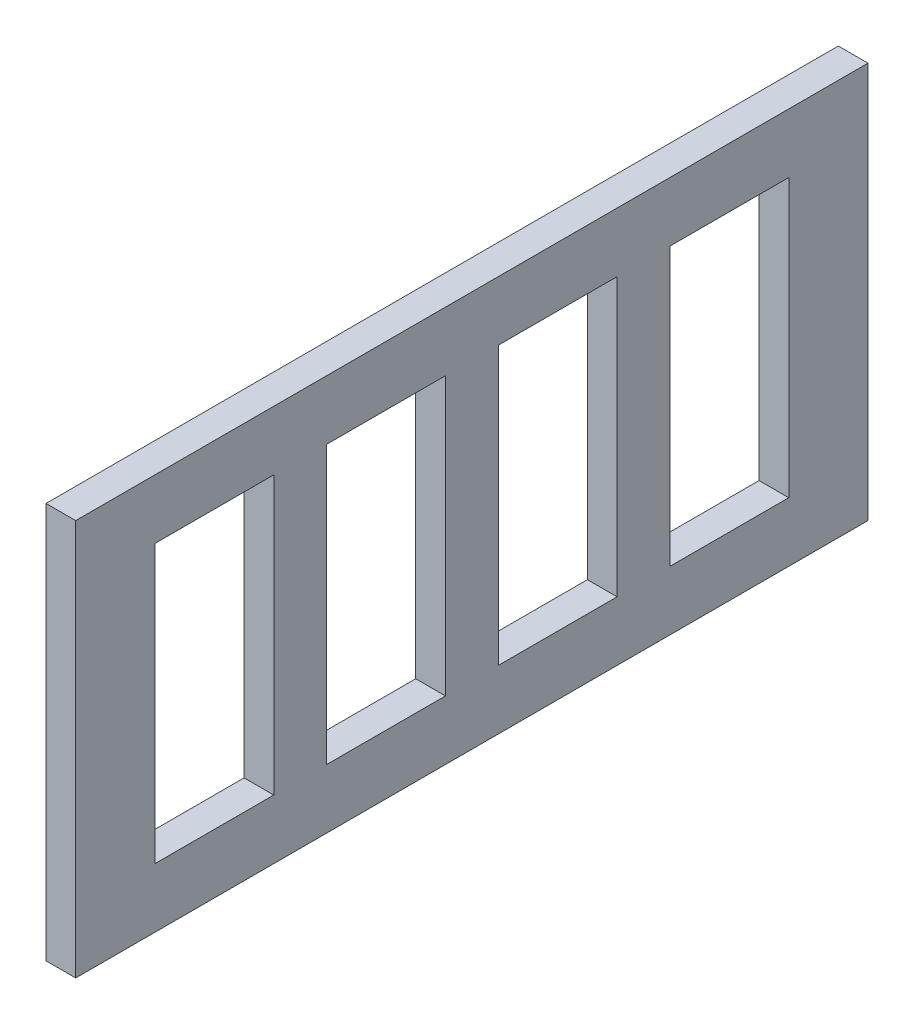
ISO-10303-21;
HEADER;
FILE_DESCRIPTION(('STEP AP214'),'2;1');
FILE_NAME('part.step','',(''),(''),'','','');
FILE_SCHEMA(('AUTOMOTIVE_DESIGN { 1 0 10303 214 1 1 1 1 }'));
ENDSEC;
DATA;
#1=APPLICATION_CONTEXT('core data for automotive mechanical design processes');
#2=APPLICATION_PROTOCOL_DEFINITION('international standard','automotive_design',2000,#1);
#3=PRODUCT_CONTEXT('',#1,'mechanical');
#4=PRODUCT('Part','Part','',(#3));
#5=PRODUCT_RELATED_PRODUCT_CATEGORY('part','',(#4));
#6=PRODUCT_DEFINITION_FORMATION('','',#4);
#7=PRODUCT_DEFINITION_CONTEXT('part definition',#1,'design');
#8=PRODUCT_DEFINITION('design','',#6,#7);
#9=PRODUCT_DEFINITION_SHAPE('','',#8);
#10=(LENGTH_UNIT() NAMED_UNIT(*) SI_UNIT(.MILLI.,.METRE.));
#11=(NAMED_UNIT(*) PLANE_ANGLE_UNIT() SI_UNIT($,.RADIAN.));
#12=(NAMED_UNIT(*) SI_UNIT($,.STERADIAN.) SOLID_ANGLE_UNIT());
#13=UNCERTAINTY_MEASURE_WITH_UNIT(LENGTH_MEASURE(1.E-05),#10,'distance_accuracy_value','');
#14=(GEOMETRIC_REPRESENTATION_CONTEXT(3) GLOBAL_UNCERTAINTY_ASSIGNED_CONTEXT((#13)) GLOBAL_UNIT_ASSIGNED_CONTEXT((#10,
#11,#12)) REPRESENTATION_CONTEXT('',''));
#15=CARTESIAN_POINT('',(0.,0.,0.));
#16=DIRECTION('',(0.,0.,1.));
#17=DIRECTION('',(1.,0.,0.));
#18=AXIS2_PLACEMENT_3D('',#15,#16,#17);
#19=CARTESIAN_POINT('',(15.,0.,0.));
#20=DIRECTION('',(-1.,0.,0.));
#21=DIRECTION('',(0.,0.,1.));
#22=AXIS2_PLACEMENT_3D('',#19,#20,#21);
#23=PLANE('',#22);
#24=DIRECTION('',(0.,0.,1.));
#25=VECTOR('',#24,1.);
#26=CARTESIAN_POINT('',(15.,170.,-13.3333333333333));
#27=LINE('',#26,#25);
#28=CARTESIAN_POINT('',(15.,170.,-73.3333333333333));
#29=VERTEX_POINT('',#28);
#30=CARTESIAN_POINT('',(15.,170.,-13.3333333333333));
#31=VERTEX_POINT('',#30);
#32=EDGE_CURVE('E225',#29,#31,#27,.T.);
#33=ORIENTED_EDGE('',*,*,#32,.F.);
#34=DIRECTION('',(0.,1.,0.));
#35=VECTOR('',#34,1.);
#36=CARTESIAN_POINT('',(15.,170.,-73.3333333333333));
#37=LINE('',#36,#35);
#38=CARTESIAN_POINT('',(15.,30.,-73.3333333333333));
#39=VERTEX_POINT('',#38);
#40=EDGE_CURVE('E236',#39,#29,#37,.T.);
#41=ORIENTED_EDGE('',*,*,#40,.F.);
#42=DIRECTION('',(0.,0.,-1.));
#43=VECTOR('',#42,1.);
#44=CARTESIAN_POINT('',(15.,30.,-13.3333333333334));
#45=LINE('',#44,#43);
#46=CARTESIAN_POINT('',(15.,30.,-13.3333333333334));
#47=VERTEX_POINT('',#46);
#48=EDGE_CURVE('E232',#47,#39,#45,.T.);
#49=ORIENTED_EDGE('',*,*,#48,.F.);
#50=DIRECTION('',(0.,-1.,0.));
#51=VECTOR('',#50,1.);
#52=CARTESIAN_POINT('',(15.,170.,-13.3333333333333));
#53=LINE('',#52,#51);
#54=EDGE_CURVE('E228',#31,#47,#53,.T.);
#55=ORIENTED_EDGE('',*,*,#54,.F.);
#56=EDGE_LOOP('',(#33,#41,#49,#55));
#57=FACE_BOUND('',#56,.T.);
#58=DIRECTION('',(0.,-1.,0.));
#59=VECTOR('',#58,1.);
#60=CARTESIAN_POINT('',(15.,170.,160.));
#61=LINE('',#60,#59);
#62=CARTESIAN_POINT('',(15.,170.,160.));
#63=VERTEX_POINT('',#62);
#64=CARTESIAN_POINT('',(15.,30.,160.));
#65=VERTEX_POINT('',#64);
#66=EDGE_CURVE('E311',#63,#65,#61,.T.);
#67=ORIENTED_EDGE('',*,*,#66,.F.);
#68=DIRECTION('',(0.,0.,1.));
#69=VECTOR('',#68,1.);
#70=CARTESIAN_POINT('',(15.,170.,160.));
#71=LINE('',#70,#69);
#72=CARTESIAN_POINT('',(15.,170.,100.));
#73=VERTEX_POINT('',#72);
#74=EDGE_CURVE('E322',#73,#63,#71,.T.);
#75=ORIENTED_EDGE('',*,*,#74,.F.);
#76=DIRECTION('',(0.,1.,0.));
#77=VECTOR('',#76,1.);
#78=CARTESIAN_POINT('',(15.,170.,100.));
#79=LINE('',#78,#77);
#80=CARTESIAN_POINT('',(15.,30.,100.));
#81=VERTEX_POINT('',#80);
#82=EDGE_CURVE('E318',#81,#73,#79,.T.);
#83=ORIENTED_EDGE('',*,*,#82,.F.);
#84=DIRECTION('',(0.,0.,-1.));
#85=VECTOR('',#84,1.);
#86=CARTESIAN_POINT('',(15.,30.,160.));
#87=LINE('',#86,#85);
#88=EDGE_CURVE('E314',#65,#81,#87,.T.);
#89=ORIENTED_EDGE('',*,*,#88,.F.);
#90=EDGE_LOOP('',(#67,#75,#83,#89));
#91=FACE_BOUND('',#90,.T.);
#92=DIRECTION('',(0.,-1.,0.));
#93=VECTOR('',#92,1.);
#94=CARTESIAN_POINT('',(15.,0.,200.));
#95=LINE('',#94,#93);
#96=CARTESIAN_POINT('',(15.,200.,200.));
#97=VERTEX_POINT('',#96);
#98=CARTESIAN_POINT('',(15.,0.,200.));
#99=VERTEX_POINT('',#98);
#100=EDGE_CURVE('E354',#97,#99,#95,.T.);
#101=ORIENTED_EDGE('',*,*,#100,.T.);
#102=DIRECTION('',(0.,0.,-1.));
#103=VECTOR('',#102,1.);
#104=CARTESIAN_POINT('',(15.,0.,200.));
#105=LINE('',#104,#103);
#106=CARTESIAN_POINT('',(15.,0.,-200.));
#107=VERTEX_POINT('',#106);
#108=EDGE_CURVE('E358',#99,#107,#105,.T.);
#109=ORIENTED_EDGE('',*,*,#108,.T.);
#110=DIRECTION('',(0.,1.,0.));
#111=VECTOR('',#110,1.);
#112=CARTESIAN_POINT('',(15.,0.,-200.));
#113=LINE('',#112,#111);
#114=CARTESIAN_POINT('',(15.,200.,-200.));
#115=VERTEX_POINT('',#114);
#116=EDGE_CURVE('E362',#107,#115,#113,.T.);
#117=ORIENTED_EDGE('',*,*,#116,.T.);
#118=DIRECTION('',(0.,0.,1.));
#119=VECTOR('',#118,1.);
#120=CARTESIAN_POINT('',(15.,200.,200.));
#121=LINE('',#120,#119);
#122=EDGE_CURVE('E365',#115,#97,#121,.T.);
#123=ORIENTED_EDGE('',*,*,#122,.T.);
#124=EDGE_LOOP('',(#101,#109,#117,#123));
#125=FACE_BOUND('',#124,.T.);
#126=DIRECTION('',(0.,0.,1.));
#127=VECTOR('',#126,1.);
#128=CARTESIAN_POINT('',(15.,170.,73.3333333333333));
#129=LINE('',#128,#127);
#130=CARTESIAN_POINT('',(15.,170.,13.3333333333333));
#131=VERTEX_POINT('',#130);
#132=CARTESIAN_POINT('',(15.,170.,73.3333333333333));
#133=VERTEX_POINT('',#132);
#134=EDGE_CURVE('E268',#131,#133,#129,.T.);
#135=ORIENTED_EDGE('',*,*,#134,.F.);
#136=DIRECTION('',(0.,1.,0.));
#137=VECTOR('',#136,1.);
#138=CARTESIAN_POINT('',(15.,170.,13.3333333333333));
#139=LINE('',#138,#137);
#140=CARTESIAN_POINT('',(15.,30.,13.3333333333333));
#141=VERTEX_POINT('',#140);
#142=EDGE_CURVE('E279',#141,#131,#139,.T.);
#143=ORIENTED_EDGE('',*,*,#142,.F.);
#144=DIRECTION('',(0.,0.,-1.));
#145=VECTOR('',#144,1.);
#146=CARTESIAN_POINT('',(15.,30.,73.3333333333333));
#147=LINE('',#146,#145);
#148=CARTESIAN_POINT('',(15.,30.,73.3333333333333));
#149=VERTEX_POINT('',#148);
#150=EDGE_CURVE('E275',#149,#141,#147,.T.);
#151=ORIENTED_EDGE('',*,*,#150,.F.);
#152=DIRECTION('',(0.,-1.,0.));
#153=VECTOR('',#152,1.);
#154=CARTESIAN_POINT('',(15.,170.,73.3333333333333));
#155=LINE('',#154,#153);
#156=EDGE_CURVE('E271',#133,#149,#155,.T.);
#157=ORIENTED_EDGE('',*,*,#156,.F.);
#158=EDGE_LOOP('',(#135,#143,#151,#157));
#159=FACE_BOUND('',#158,.T.);
#160=DIRECTION('',(0.,0.,1.));
#161=VECTOR('',#160,1.);
#162=CARTESIAN_POINT('',(15.,170.,-100.));
#163=LINE('',#162,#161);
#164=CARTESIAN_POINT('',(15.,170.,-160.));
#165=VERTEX_POINT('',#164);
#166=CARTESIAN_POINT('',(15.,170.,-100.));
#167=VERTEX_POINT('',#166);
#168=EDGE_CURVE('E177',#165,#167,#163,.T.);
#169=ORIENTED_EDGE('',*,*,#168,.F.);
#170=DIRECTION('',(0.,1.,0.));
#171=VECTOR('',#170,1.);
#172=CARTESIAN_POINT('',(15.,170.,-160.));
#173=LINE('',#172,#171);
#174=CARTESIAN_POINT('',(15.,30.,-160.));
#175=VERTEX_POINT('',#174);
#176=EDGE_CURVE('E203',#175,#165,#173,.T.);
#177=ORIENTED_EDGE('',*,*,#176,.F.);
#178=DIRECTION('',(0.,0.,-1.));
#179=VECTOR('',#178,1.);
#180=CARTESIAN_POINT('',(15.,30.,-100.));
#181=LINE('',#180,#179);
#182=CARTESIAN_POINT('',(15.,30.,-100.));
#183=VERTEX_POINT('',#182);
#184=EDGE_CURVE('E199',#183,#175,#181,.T.);
#185=ORIENTED_EDGE('',*,*,#184,.F.);
#186=DIRECTION('',(0.,-1.,0.));
#187=VECTOR('',#186,1.);
#188=CARTESIAN_POINT('',(15.,170.,-100.));
#189=LINE('',#188,#187);
#190=EDGE_CURVE('E186',#167,#183,#189,.T.);
#191=ORIENTED_EDGE('',*,*,#190,.F.);
#192=EDGE_LOOP('',(#169,#177,#185,#191));
#193=FACE_BOUND('',#192,.T.);
#194=ADVANCED_FACE('F39',(#57,#91,#125,#159,#193),#23,.F.);
#195=CARTESIAN_POINT('',(0.,0.,0.));
#196=DIRECTION('',(-1.,0.,0.));
#197=DIRECTION('',(0.,0.,1.));
#198=AXIS2_PLACEMENT_3D('',#195,#196,#197);
#199=PLANE('',#198);
#200=DIRECTION('',(0.,-1.,0.));
#201=VECTOR('',#200,1.);
#202=CARTESIAN_POINT('',(0.,0.,200.));
#203=LINE('',#202,#201);
#204=CARTESIAN_POINT('',(0.,200.,200.));
#205=VERTEX_POINT('',#204);
#206=CARTESIAN_POINT('',(0.,0.,200.));
#207=VERTEX_POINT('',#206);
#208=EDGE_CURVE('E353',#205,#207,#203,.T.);
#209=ORIENTED_EDGE('',*,*,#208,.F.);
#210=DIRECTION('',(0.,0.,1.));
#211=VECTOR('',#210,1.);
#212=CARTESIAN_POINT('',(0.,200.,200.));
#213=LINE('',#212,#211);
#214=CARTESIAN_POINT('',(0.,200.,-200.));
#215=VERTEX_POINT('',#214);
#216=EDGE_CURVE('E359',#215,#205,#213,.T.);
#217=ORIENTED_EDGE('',*,*,#216,.F.);
#218=DIRECTION('',(0.,1.,0.));
#219=VECTOR('',#218,1.);
#220=CARTESIAN_POINT('',(0.,0.,-200.));
#221=LINE('',#220,#219);
#222=CARTESIAN_POINT('',(0.,0.,-200.));
#223=VERTEX_POINT('',#222);
#224=EDGE_CURVE('E375',#223,#215,#221,.T.);
#225=ORIENTED_EDGE('',*,*,#224,.F.);
#226=DIRECTION('',(0.,0.,-1.));
#227=VECTOR('',#226,1.);
#228=CARTESIAN_POINT('',(0.,0.,200.));
#229=LINE('',#228,#227);
#230=EDGE_CURVE('E372',#207,#223,#229,.T.);
#231=ORIENTED_EDGE('',*,*,#230,.F.);
#232=EDGE_LOOP('',(#209,#217,#225,#231));
#233=FACE_BOUND('',#232,.T.);
#234=DIRECTION('',(0.,0.,1.));
#235=VECTOR('',#234,1.);
#236=CARTESIAN_POINT('',(0.,170.,160.));
#237=LINE('',#236,#235);
#238=CARTESIAN_POINT('',(0.,170.,100.));
#239=VERTEX_POINT('',#238);
#240=CARTESIAN_POINT('',(0.,170.,160.));
#241=VERTEX_POINT('',#240);
#242=EDGE_CURVE('E315',#239,#241,#237,.T.);
#243=ORIENTED_EDGE('',*,*,#242,.T.);
#244=DIRECTION('',(0.,-1.,0.));
#245=VECTOR('',#244,1.);
#246=CARTESIAN_POINT('',(0.,170.,160.));
#247=LINE('',#246,#245);
#248=CARTESIAN_POINT('',(0.,30.,160.));
#249=VERTEX_POINT('',#248);
#250=EDGE_CURVE('E310',#241,#249,#247,.T.);
#251=ORIENTED_EDGE('',*,*,#250,.T.);
#252=DIRECTION('',(0.,0.,-1.));
#253=VECTOR('',#252,1.);
#254=CARTESIAN_POINT('',(0.,30.,160.));
#255=LINE('',#254,#253);
#256=CARTESIAN_POINT('',(0.,30.,100.));
#257=VERTEX_POINT('',#256);
#258=EDGE_CURVE('E329',#249,#257,#255,.T.);
#259=ORIENTED_EDGE('',*,*,#258,.T.);
#260=DIRECTION('',(0.,1.,0.));
#261=VECTOR('',#260,1.);
#262=CARTESIAN_POINT('',(0.,170.,100.));
#263=LINE('',#262,#261);
#264=EDGE_CURVE('E333',#257,#239,#263,.T.);
#265=ORIENTED_EDGE('',*,*,#264,.T.);
#266=EDGE_LOOP('',(#243,#251,#259,#265));
#267=FACE_BOUND('',#266,.T.);
#268=DIRECTION('',(0.,1.,0.));
#269=VECTOR('',#268,1.);
#270=CARTESIAN_POINT('',(0.,170.,13.3333333333333));
#271=LINE('',#270,#269);
#272=CARTESIAN_POINT('',(0.,30.,13.3333333333333));
#273=VERTEX_POINT('',#272);
#274=CARTESIAN_POINT('',(0.,170.,13.3333333333333));
#275=VERTEX_POINT('',#274);
#276=EDGE_CURVE('E272',#273,#275,#271,.T.);
#277=ORIENTED_EDGE('',*,*,#276,.T.);
#278=DIRECTION('',(0.,0.,1.));
#279=VECTOR('',#278,1.);
#280=CARTESIAN_POINT('',(0.,170.,73.3333333333333));
#281=LINE('',#280,#279);
#282=CARTESIAN_POINT('',(0.,170.,73.3333333333333));
#283=VERTEX_POINT('',#282);
#284=EDGE_CURVE('E267',#275,#283,#281,.T.);
#285=ORIENTED_EDGE('',*,*,#284,.T.);
#286=DIRECTION('',(0.,-1.,0.));
#287=VECTOR('',#286,1.);
#288=CARTESIAN_POINT('',(0.,170.,73.3333333333333));
#289=LINE('',#288,#287);
#290=CARTESIAN_POINT('',(0.,30.,73.3333333333333));
#291=VERTEX_POINT('',#290);
#292=EDGE_CURVE('E286',#283,#291,#289,.T.);
#293=ORIENTED_EDGE('',*,*,#292,.T.);
#294=DIRECTION('',(0.,0.,-1.));
#295=VECTOR('',#294,1.);
#296=CARTESIAN_POINT('',(0.,30.,73.3333333333333));
#297=LINE('',#296,#295);
#298=EDGE_CURVE('E290',#291,#273,#297,.T.);
#299=ORIENTED_EDGE('',*,*,#298,.T.);
#300=EDGE_LOOP('',(#277,#285,#293,#299));
#301=FACE_BOUND('',#300,.T.);
#302=DIRECTION('',(0.,1.,0.));
#303=VECTOR('',#302,1.);
#304=CARTESIAN_POINT('',(0.,170.,-73.3333333333333));
#305=LINE('',#304,#303);
#306=CARTESIAN_POINT('',(0.,30.,-73.3333333333333));
#307=VERTEX_POINT('',#306);
#308=CARTESIAN_POINT('',(0.,170.,-73.3333333333333));
#309=VERTEX_POINT('',#308);
#310=EDGE_CURVE('E229',#307,#309,#305,.T.);
#311=ORIENTED_EDGE('',*,*,#310,.T.);
#312=DIRECTION('',(0.,0.,1.));
#313=VECTOR('',#312,1.);
#314=CARTESIAN_POINT('',(0.,170.,-13.3333333333333));
#315=LINE('',#314,#313);
#316=CARTESIAN_POINT('',(0.,170.,-13.3333333333333));
#317=VERTEX_POINT('',#316);
#318=EDGE_CURVE('E195',#309,#317,#315,.T.);
#319=ORIENTED_EDGE('',*,*,#318,.T.);
#320=DIRECTION('',(0.,-1.,0.));
#321=VECTOR('',#320,1.);
#322=CARTESIAN_POINT('',(0.,170.,-13.3333333333333));
#323=LINE('',#322,#321);
#324=CARTESIAN_POINT('',(0.,30.,-13.3333333333334));
#325=VERTEX_POINT('',#324);
#326=EDGE_CURVE('E243',#317,#325,#323,.T.);
#327=ORIENTED_EDGE('',*,*,#326,.T.);
#328=DIRECTION('',(0.,0.,-1.));
#329=VECTOR('',#328,1.);
#330=CARTESIAN_POINT('',(0.,30.,-13.3333333333334));
#331=LINE('',#330,#329);
#332=EDGE_CURVE('E247',#325,#307,#331,.T.);
#333=ORIENTED_EDGE('',*,*,#332,.T.);
#334=EDGE_LOOP('',(#311,#319,#327,#333));
#335=FACE_BOUND('',#334,.T.);
#336=DIRECTION('',(0.,1.,0.));
#337=VECTOR('',#336,1.);
#338=CARTESIAN_POINT('',(0.,170.,-160.));
#339=LINE('',#338,#337);
#340=CARTESIAN_POINT('',(0.,30.,-160.));
#341=VERTEX_POINT('',#340);
#342=CARTESIAN_POINT('',(0.,170.,-160.));
#343=VERTEX_POINT('',#342);
#344=EDGE_CURVE('E187',#341,#343,#339,.T.);
#345=ORIENTED_EDGE('',*,*,#344,.T.);
#346=DIRECTION('',(0.,0.,1.));
#347=VECTOR('',#346,1.);
#348=CARTESIAN_POINT('',(0.,170.,-100.));
#349=LINE('',#348,#347);
#350=CARTESIAN_POINT('',(0.,170.,-100.));
#351=VERTEX_POINT('',#350);
#352=EDGE_CURVE('E63',#343,#351,#349,.T.);
#353=ORIENTED_EDGE('',*,*,#352,.T.);
#354=DIRECTION('',(0.,-1.,0.));
#355=VECTOR('',#354,1.);
#356=CARTESIAN_POINT('',(0.,170.,-100.));
#357=LINE('',#356,#355);
#358=CARTESIAN_POINT('',(0.,30.,-100.));
#359=VERTEX_POINT('',#358);
#360=EDGE_CURVE('E193',#351,#359,#357,.T.);
#361=ORIENTED_EDGE('',*,*,#360,.T.);
#362=DIRECTION('',(0.,0.,-1.));
#363=VECTOR('',#362,1.);
#364=CARTESIAN_POINT('',(0.,30.,-100.));
#365=LINE('',#364,#363);
#366=EDGE_CURVE('E212',#359,#341,#365,.T.);
#367=ORIENTED_EDGE('',*,*,#366,.T.);
#368=EDGE_LOOP('',(#345,#353,#361,#367));
#369=FACE_BOUND('',#368,.T.);
#370=ADVANCED_FACE('F398',(#233,#267,#301,#335,#369),#199,.T.);
#371=CARTESIAN_POINT('',(15.,0.,200.));
#372=DIRECTION('',(0.,0.,-1.));
#373=DIRECTION('',(-1.,0.,0.));
#374=AXIS2_PLACEMENT_3D('',#371,#372,#373);
#375=PLANE('',#374);
#376=ORIENTED_EDGE('',*,*,#208,.T.);
#377=DIRECTION('',(-1.,0.,0.));
#378=VECTOR('',#377,1.);
#379=CARTESIAN_POINT('',(15.,0.,200.));
#380=LINE('',#379,#378);
#381=EDGE_CURVE('E11',#99,#207,#380,.T.);
#382=ORIENTED_EDGE('',*,*,#381,.F.);
#383=ORIENTED_EDGE('',*,*,#100,.F.);
#384=DIRECTION('',(-1.,0.,0.));
#385=VECTOR('',#384,1.);
#386=CARTESIAN_POINT('',(15.,200.,200.));
#387=LINE('',#386,#385);
#388=EDGE_CURVE('E368',#97,#205,#387,.T.);
#389=ORIENTED_EDGE('',*,*,#388,.T.);
#390=EDGE_LOOP('',(#376,#382,#383,#389));
#391=FACE_BOUND('',#390,.T.);
#392=ADVANCED_FACE('F41',(#391),#375,.F.);
#393=CARTESIAN_POINT('',(15.,0.,200.));
#394=DIRECTION('',(0.,1.,0.));
#395=DIRECTION('',(0.,0.,1.));
#396=AXIS2_PLACEMENT_3D('',#393,#394,#395);
#397=PLANE('',#396);
#398=ORIENTED_EDGE('',*,*,#230,.T.);
#399=DIRECTION('',(-1.,0.,0.));
#400=VECTOR('',#399,1.);
#401=CARTESIAN_POINT('',(15.,0.,-200.));
#402=LINE('',#401,#400);
#403=EDGE_CURVE('E48',#107,#223,#402,.T.);
#404=ORIENTED_EDGE('',*,*,#403,.F.);
#405=ORIENTED_EDGE('',*,*,#108,.F.);
#406=ORIENTED_EDGE('',*,*,#381,.T.);
#407=EDGE_LOOP('',(#398,#404,#405,#406));
#408=FACE_BOUND('',#407,.T.);
#409=ADVANCED_FACE('F409',(#408),#397,.F.);
#410=CARTESIAN_POINT('',(15.,0.,-200.));
#411=DIRECTION('',(0.,0.,1.));
#412=DIRECTION('',(1.,0.,0.));
#413=AXIS2_PLACEMENT_3D('',#410,#411,#412);
#414=PLANE('',#413);
#415=ORIENTED_EDGE('',*,*,#224,.T.);
#416=DIRECTION('',(-1.,0.,0.));
#417=VECTOR('',#416,1.);
#418=CARTESIAN_POINT('',(15.,200.,-200.));
#419=LINE('',#418,#417);
#420=EDGE_CURVE('E383',#115,#215,#419,.T.);
#421=ORIENTED_EDGE('',*,*,#420,.F.);
#422=ORIENTED_EDGE('',*,*,#116,.F.);
#423=ORIENTED_EDGE('',*,*,#403,.T.);
#424=EDGE_LOOP('',(#415,#421,#422,#423));
#425=FACE_BOUND('',#424,.T.);
#426=ADVANCED_FACE('F392',(#425),#414,.F.);
#427=CARTESIAN_POINT('',(15.,200.,200.));
#428=DIRECTION('',(0.,-1.,0.));
#429=DIRECTION('',(0.,0.,-1.));
#430=AXIS2_PLACEMENT_3D('',#427,#428,#429);
#431=PLANE('',#430);
#432=ORIENTED_EDGE('',*,*,#216,.T.);
#433=ORIENTED_EDGE('',*,*,#388,.F.);
#434=ORIENTED_EDGE('',*,*,#122,.F.);
#435=ORIENTED_EDGE('',*,*,#420,.T.);
#436=EDGE_LOOP('',(#432,#433,#434,#435));
#437=FACE_BOUND('',#436,.T.);
#438=ADVANCED_FACE('F402',(#437),#431,.F.);
#439=CARTESIAN_POINT('',(15.,170.,160.));
#440=DIRECTION('',(0.,0.,-1.));
#441=DIRECTION('',(0.,1.,0.));
#442=AXIS2_PLACEMENT_3D('',#439,#440,#441);
#443=PLANE('',#442);
#444=ORIENTED_EDGE('',*,*,#250,.F.);
#445=DIRECTION('',(-1.,0.,0.));
#446=VECTOR('',#445,1.);
#447=CARTESIAN_POINT('',(15.,170.,160.));
#448=LINE('',#447,#446);
#449=EDGE_CURVE('E325',#63,#241,#448,.T.);
#450=ORIENTED_EDGE('',*,*,#449,.F.);
#451=ORIENTED_EDGE('',*,*,#66,.T.);
#452=DIRECTION('',(-1.,0.,0.));
#453=VECTOR('',#452,1.);
#454=CARTESIAN_POINT('',(15.,30.,160.));
#455=LINE('',#454,#453);
#456=EDGE_CURVE('E349',#65,#249,#455,.T.);
#457=ORIENTED_EDGE('',*,*,#456,.T.);
#458=EDGE_LOOP('',(#444,#450,#451,#457));
#459=FACE_BOUND('',#458,.T.);
#460=ADVANCED_FACE('F426',(#459),#443,.T.);
#461=CARTESIAN_POINT('',(15.,30.,160.));
#462=DIRECTION('',(0.,1.,0.));
#463=DIRECTION('',(0.,0.,1.));
#464=AXIS2_PLACEMENT_3D('',#461,#462,#463);
#465=PLANE('',#464);
#466=ORIENTED_EDGE('',*,*,#258,.F.);
#467=ORIENTED_EDGE('',*,*,#456,.F.);
#468=ORIENTED_EDGE('',*,*,#88,.T.);
#469=DIRECTION('',(-1.,0.,0.));
#470=VECTOR('',#469,1.);
#471=CARTESIAN_POINT('',(15.,30.,100.));
#472=LINE('',#471,#470);
#473=EDGE_CURVE('E346',#81,#257,#472,.T.);
#474=ORIENTED_EDGE('',*,*,#473,.T.);
#475=EDGE_LOOP('',(#466,#467,#468,#474));
#476=FACE_BOUND('',#475,.T.);
#477=ADVANCED_FACE('F433',(#476),#465,.T.);
#478=CARTESIAN_POINT('',(15.,170.,100.));
#479=DIRECTION('',(0.,0.,1.));
#480=DIRECTION('',(0.,-1.,0.));
#481=AXIS2_PLACEMENT_3D('',#478,#479,#480);
#482=PLANE('',#481);
#483=ORIENTED_EDGE('',*,*,#264,.F.);
#484=ORIENTED_EDGE('',*,*,#473,.F.);
#485=ORIENTED_EDGE('',*,*,#82,.T.);
#486=DIRECTION('',(-1.,0.,0.));
#487=VECTOR('',#486,1.);
#488=CARTESIAN_POINT('',(15.,170.,100.));
#489=LINE('',#488,#487);
#490=EDGE_CURVE('E343',#73,#239,#489,.T.);
#491=ORIENTED_EDGE('',*,*,#490,.T.);
#492=EDGE_LOOP('',(#483,#484,#485,#491));
#493=FACE_BOUND('',#492,.T.);
#494=ADVANCED_FACE('F438',(#493),#482,.T.);
#495=CARTESIAN_POINT('',(15.,170.,160.));
#496=DIRECTION('',(0.,-1.,0.));
#497=DIRECTION('',(0.,0.,-1.));
#498=AXIS2_PLACEMENT_3D('',#495,#496,#497);
#499=PLANE('',#498);
#500=ORIENTED_EDGE('',*,*,#242,.F.);
#501=ORIENTED_EDGE('',*,*,#490,.F.);
#502=ORIENTED_EDGE('',*,*,#74,.T.);
#503=ORIENTED_EDGE('',*,*,#449,.T.);
#504=EDGE_LOOP('',(#500,#501,#502,#503));
#505=FACE_BOUND('',#504,.T.);
#506=ADVANCED_FACE('F445',(#505),#499,.T.);
#507=CARTESIAN_POINT('',(15.,170.,73.3333333333333));
#508=DIRECTION('',(0.,-1.,0.));
#509=DIRECTION('',(0.,0.,-1.));
#510=AXIS2_PLACEMENT_3D('',#507,#508,#509);
#511=PLANE('',#510);
#512=ORIENTED_EDGE('',*,*,#284,.F.);
#513=DIRECTION('',(-1.,0.,0.));
#514=VECTOR('',#513,1.);
#515=CARTESIAN_POINT('',(15.,170.,13.3333333333333));
#516=LINE('',#515,#514);
#517=EDGE_CURVE('E282',#131,#275,#516,.T.);
#518=ORIENTED_EDGE('',*,*,#517,.F.);
#519=ORIENTED_EDGE('',*,*,#134,.T.);
#520=DIRECTION('',(-1.,0.,0.));
#521=VECTOR('',#520,1.);
#522=CARTESIAN_POINT('',(15.,170.,73.3333333333333));
#523=LINE('',#522,#521);
#524=EDGE_CURVE('E306',#133,#283,#523,.T.);
#525=ORIENTED_EDGE('',*,*,#524,.T.);
#526=EDGE_LOOP('',(#512,#518,#519,#525));
#527=FACE_BOUND('',#526,.T.);
#528=ADVANCED_FACE('F458',(#527),#511,.T.);
#529=CARTESIAN_POINT('',(15.,170.,73.3333333333333));
#530=DIRECTION('',(0.,0.,-1.));
#531=DIRECTION('',(0.,1.,0.));
#532=AXIS2_PLACEMENT_3D('',#529,#530,#531);
#533=PLANE('',#532);
#534=ORIENTED_EDGE('',*,*,#292,.F.);
#535=ORIENTED_EDGE('',*,*,#524,.F.);
#536=ORIENTED_EDGE('',*,*,#156,.T.);
#537=DIRECTION('',(-1.,0.,0.));
#538=VECTOR('',#537,1.);
#539=CARTESIAN_POINT('',(15.,30.,73.3333333333333));
#540=LINE('',#539,#538);
#541=EDGE_CURVE('E303',#149,#291,#540,.T.);
#542=ORIENTED_EDGE('',*,*,#541,.T.);
#543=EDGE_LOOP('',(#534,#535,#536,#542));
#544=FACE_BOUND('',#543,.T.);
#545=ADVANCED_FACE('F463',(#544),#533,.T.);
#546=CARTESIAN_POINT('',(15.,30.,73.3333333333333));
#547=DIRECTION('',(0.,1.,0.));
#548=DIRECTION('',(0.,0.,1.));
#549=AXIS2_PLACEMENT_3D('',#546,#547,#548);
#550=PLANE('',#549);
#551=ORIENTED_EDGE('',*,*,#298,.F.);
#552=ORIENTED_EDGE('',*,*,#541,.F.);
#553=ORIENTED_EDGE('',*,*,#150,.T.);
#554=DIRECTION('',(-1.,0.,0.));
#555=VECTOR('',#554,1.);
#556=CARTESIAN_POINT('',(15.,30.,13.3333333333333));
#557=LINE('',#556,#555);
#558=EDGE_CURVE('E300',#141,#273,#557,.T.);
#559=ORIENTED_EDGE('',*,*,#558,.T.);
#560=EDGE_LOOP('',(#551,#552,#553,#559));
#561=FACE_BOUND('',#560,.T.);
#562=ADVANCED_FACE('F467',(#561),#550,.T.);
#563=CARTESIAN_POINT('',(15.,170.,13.3333333333333));
#564=DIRECTION('',(0.,0.,1.));
#565=DIRECTION('',(0.,-1.,0.));
#566=AXIS2_PLACEMENT_3D('',#563,#564,#565);
#567=PLANE('',#566);
#568=ORIENTED_EDGE('',*,*,#276,.F.);
#569=ORIENTED_EDGE('',*,*,#558,.F.);
#570=ORIENTED_EDGE('',*,*,#142,.T.);
#571=ORIENTED_EDGE('',*,*,#517,.T.);
#572=EDGE_LOOP('',(#568,#569,#570,#571));
#573=FACE_BOUND('',#572,.T.);
#574=ADVANCED_FACE('F471',(#573),#567,.T.);
#575=CARTESIAN_POINT('',(15.,170.,-13.3333333333333));
#576=DIRECTION('',(0.,-1.,0.));
#577=DIRECTION('',(0.,0.,-1.));
#578=AXIS2_PLACEMENT_3D('',#575,#576,#577);
#579=PLANE('',#578);
#580=ORIENTED_EDGE('',*,*,#318,.F.);
#581=DIRECTION('',(-1.,0.,0.));
#582=VECTOR('',#581,1.);
#583=CARTESIAN_POINT('',(15.,170.,-73.3333333333333));
#584=LINE('',#583,#582);
#585=EDGE_CURVE('E239',#29,#309,#584,.T.);
#586=ORIENTED_EDGE('',*,*,#585,.F.);
#587=ORIENTED_EDGE('',*,*,#32,.T.);
#588=DIRECTION('',(-1.,0.,0.));
#589=VECTOR('',#588,1.);
#590=CARTESIAN_POINT('',(15.,170.,-13.3333333333333));
#591=LINE('',#590,#589);
#592=EDGE_CURVE('E263',#31,#317,#591,.T.);
#593=ORIENTED_EDGE('',*,*,#592,.T.);
#594=EDGE_LOOP('',(#580,#586,#587,#593));
#595=FACE_BOUND('',#594,.T.);
#596=ADVANCED_FACE('F475',(#595),#579,.T.);
#597=CARTESIAN_POINT('',(15.,170.,-13.3333333333333));
#598=DIRECTION('',(0.,0.,-1.));
#599=DIRECTION('',(0.,1.,0.));
#600=AXIS2_PLACEMENT_3D('',#597,#598,#599);
#601=PLANE('',#600);
#602=ORIENTED_EDGE('',*,*,#326,.F.);
#603=ORIENTED_EDGE('',*,*,#592,.F.);
#604=ORIENTED_EDGE('',*,*,#54,.T.);
#605=DIRECTION('',(-1.,0.,0.));
#606=VECTOR('',#605,1.);
#607=CARTESIAN_POINT('',(15.,30.,-13.3333333333334));
#608=LINE('',#607,#606);
#609=EDGE_CURVE('E260',#47,#325,#608,.T.);
#610=ORIENTED_EDGE('',*,*,#609,.T.);
#611=EDGE_LOOP('',(#602,#603,#604,#610));
#612=FACE_BOUND('',#611,.T.);
#613=ADVANCED_FACE('F479',(#612),#601,.T.);
#614=CARTESIAN_POINT('',(15.,30.,-13.3333333333334));
#615=DIRECTION('',(0.,1.,0.));
#616=DIRECTION('',(0.,0.,1.));
#617=AXIS2_PLACEMENT_3D('',#614,#615,#616);
#618=PLANE('',#617);
#619=ORIENTED_EDGE('',*,*,#332,.F.);
#620=ORIENTED_EDGE('',*,*,#609,.F.);
#621=ORIENTED_EDGE('',*,*,#48,.T.);
#622=DIRECTION('',(-1.,0.,0.));
#623=VECTOR('',#622,1.);
#624=CARTESIAN_POINT('',(15.,30.,-73.3333333333333));
#625=LINE('',#624,#623);
#626=EDGE_CURVE('E257',#39,#307,#625,.T.);
#627=ORIENTED_EDGE('',*,*,#626,.T.);
#628=EDGE_LOOP('',(#619,#620,#621,#627));
#629=FACE_BOUND('',#628,.T.);
#630=ADVANCED_FACE('F483',(#629),#618,.T.);
#631=CARTESIAN_POINT('',(15.,170.,-73.3333333333333));
#632=DIRECTION('',(0.,0.,1.));
#633=DIRECTION('',(0.,-1.,0.));
#634=AXIS2_PLACEMENT_3D('',#631,#632,#633);
#635=PLANE('',#634);
#636=ORIENTED_EDGE('',*,*,#310,.F.);
#637=ORIENTED_EDGE('',*,*,#626,.F.);
#638=ORIENTED_EDGE('',*,*,#40,.T.);
#639=ORIENTED_EDGE('',*,*,#585,.T.);
#640=EDGE_LOOP('',(#636,#637,#638,#639));
#641=FACE_BOUND('',#640,.T.);
#642=ADVANCED_FACE('F487',(#641),#635,.T.);
#643=CARTESIAN_POINT('',(15.,170.,-100.));
#644=DIRECTION('',(0.,-1.,0.));
#645=DIRECTION('',(0.,0.,-1.));
#646=AXIS2_PLACEMENT_3D('',#643,#644,#645);
#647=PLANE('',#646);
#648=ORIENTED_EDGE('',*,*,#352,.F.);
#649=DIRECTION('',(-1.,0.,0.));
#650=VECTOR('',#649,1.);
#651=CARTESIAN_POINT('',(15.,170.,-160.));
#652=LINE('',#651,#650);
#653=EDGE_CURVE('E181',#165,#343,#652,.T.);
#654=ORIENTED_EDGE('',*,*,#653,.F.);
#655=ORIENTED_EDGE('',*,*,#168,.T.);
#656=DIRECTION('',(-1.,0.,0.));
#657=VECTOR('',#656,1.);
#658=CARTESIAN_POINT('',(15.,170.,-100.));
#659=LINE('',#658,#657);
#660=EDGE_CURVE('E180',#167,#351,#659,.T.);
#661=ORIENTED_EDGE('',*,*,#660,.T.);
#662=EDGE_LOOP('',(#648,#654,#655,#661));
#663=FACE_BOUND('',#662,.T.);
#664=ADVANCED_FACE('F179',(#663),#647,.T.);
#665=CARTESIAN_POINT('',(15.,170.,-100.));
#666=DIRECTION('',(0.,0.,-1.));
#667=DIRECTION('',(0.,1.,0.));
#668=AXIS2_PLACEMENT_3D('',#665,#666,#667);
#669=PLANE('',#668);
#670=ORIENTED_EDGE('',*,*,#360,.F.);
#671=ORIENTED_EDGE('',*,*,#660,.F.);
#672=ORIENTED_EDGE('',*,*,#190,.T.);
#673=DIRECTION('',(-1.,0.,0.));
#674=VECTOR('',#673,1.);
#675=CARTESIAN_POINT('',(15.,30.,-100.));
#676=LINE('',#675,#674);
#677=EDGE_CURVE('E196',#183,#359,#676,.T.);
#678=ORIENTED_EDGE('',*,*,#677,.T.);
#679=EDGE_LOOP('',(#670,#671,#672,#678));
#680=FACE_BOUND('',#679,.T.);
#681=ADVANCED_FACE('F190',(#680),#669,.T.);
#682=CARTESIAN_POINT('',(15.,30.,-100.));
#683=DIRECTION('',(0.,1.,0.));
#684=DIRECTION('',(0.,0.,1.));
#685=AXIS2_PLACEMENT_3D('',#682,#683,#684);
#686=PLANE('',#685);
#687=ORIENTED_EDGE('',*,*,#366,.F.);
#688=ORIENTED_EDGE('',*,*,#677,.F.);
#689=ORIENTED_EDGE('',*,*,#184,.T.);
#690=DIRECTION('',(-1.,0.,0.));
#691=VECTOR('',#690,1.);
#692=CARTESIAN_POINT('',(15.,30.,-160.));
#693=LINE('',#692,#691);
#694=EDGE_CURVE('E55',#175,#341,#693,.T.);
#695=ORIENTED_EDGE('',*,*,#694,.T.);
#696=EDGE_LOOP('',(#687,#688,#689,#695));
#697=FACE_BOUND('',#696,.T.);
#698=ADVANCED_FACE('F496',(#697),#686,.T.);
#699=CARTESIAN_POINT('',(15.,170.,-160.));
#700=DIRECTION('',(0.,0.,1.));
#701=DIRECTION('',(0.,-1.,0.));
#702=AXIS2_PLACEMENT_3D('',#699,#700,#701);
#703=PLANE('',#702);
#704=ORIENTED_EDGE('',*,*,#344,.F.);
#705=ORIENTED_EDGE('',*,*,#694,.F.);
#706=ORIENTED_EDGE('',*,*,#176,.T.);
#707=ORIENTED_EDGE('',*,*,#653,.T.);
#708=EDGE_LOOP('',(#704,#705,#706,#707));
#709=FACE_BOUND('',#708,.T.);
#710=ADVANCED_FACE('F499',(#709),#703,.T.);
#711=CLOSED_SHELL('',(#194,#370,#392,#409,#426,#438,#460,#477,#494,#506,#528,#545,#562,#574,
#596,#613,#630,#642,#664,#681,#698,#710));
#712=MANIFOLD_SOLID_BREP('B2',#711);
#713=ADVANCED_BREP_SHAPE_REPRESENTATION('',(#18,#712),#14);
#714=SHAPE_DEFINITION_REPRESENTATION(#9,#713);
ENDSEC;
END-ISO-10303-21;
